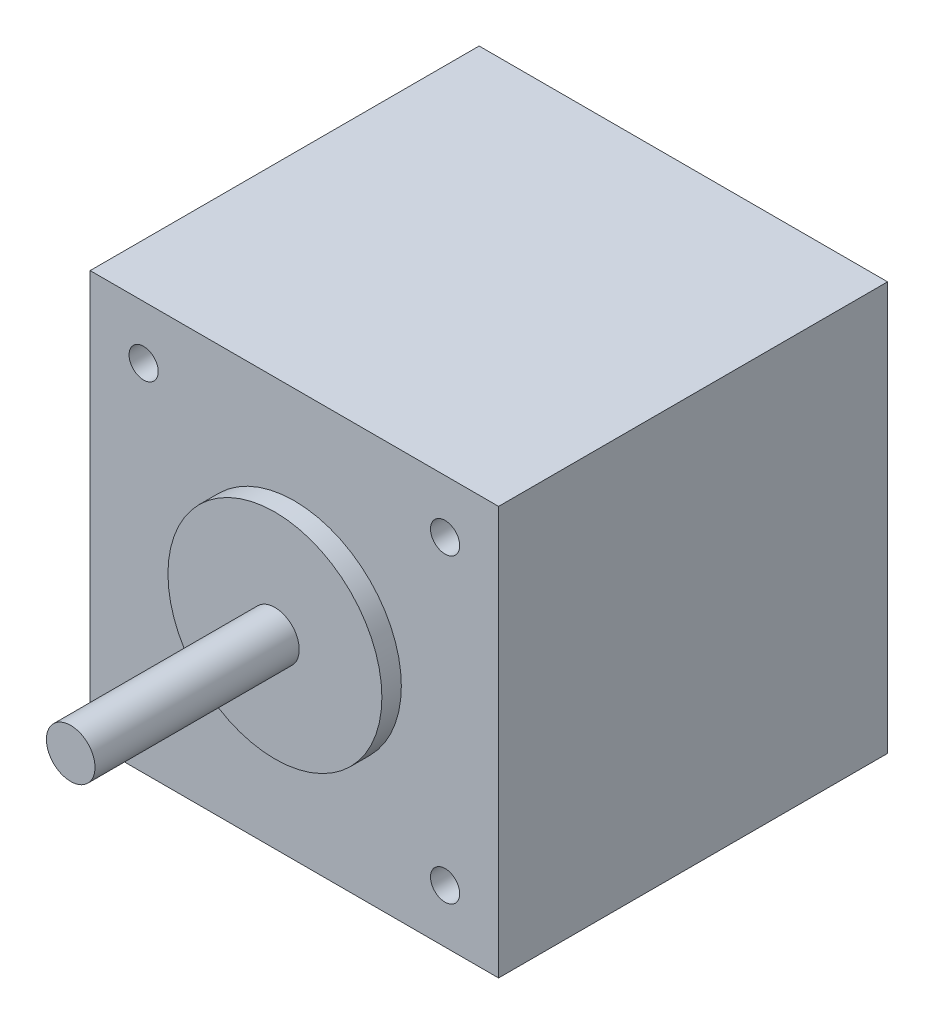
ISO-10303-21;
HEADER;
FILE_DESCRIPTION(('STEP AP214'),'2;1');
FILE_NAME('part.step','',(''),(''),'','','');
FILE_SCHEMA(('AUTOMOTIVE_DESIGN { 1 0 10303 214 1 1 1 1 }'));
ENDSEC;
DATA;
#1=APPLICATION_CONTEXT('core data for automotive mechanical design processes');
#2=APPLICATION_PROTOCOL_DEFINITION('international standard','automotive_design',2000,#1);
#3=PRODUCT_CONTEXT('',#1,'mechanical');
#4=PRODUCT('Part','Part','',(#3));
#5=PRODUCT_RELATED_PRODUCT_CATEGORY('part','',(#4));
#6=PRODUCT_DEFINITION_FORMATION('','',#4);
#7=PRODUCT_DEFINITION_CONTEXT('part definition',#1,'design');
#8=PRODUCT_DEFINITION('design','',#6,#7);
#9=PRODUCT_DEFINITION_SHAPE('','',#8);
#10=(LENGTH_UNIT() NAMED_UNIT(*) SI_UNIT(.MILLI.,.METRE.));
#11=(NAMED_UNIT(*) PLANE_ANGLE_UNIT() SI_UNIT($,.RADIAN.));
#12=(NAMED_UNIT(*) SI_UNIT($,.STERADIAN.) SOLID_ANGLE_UNIT());
#13=UNCERTAINTY_MEASURE_WITH_UNIT(LENGTH_MEASURE(1.E-05),#10,'distance_accuracy_value','');
#14=(GEOMETRIC_REPRESENTATION_CONTEXT(3) GLOBAL_UNCERTAINTY_ASSIGNED_CONTEXT((#13)) GLOBAL_UNIT_ASSIGNED_CONTEXT((#10,
#11,#12)) REPRESENTATION_CONTEXT('',''));
#15=CARTESIAN_POINT('',(0.,0.,0.));
#16=DIRECTION('',(0.,0.,1.));
#17=DIRECTION('',(1.,0.,0.));
#18=AXIS2_PLACEMENT_3D('',#15,#16,#17);
#19=CARTESIAN_POINT('',(21.,-21.,40.));
#20=DIRECTION('',(-1.,0.,0.));
#21=DIRECTION('',(0.,0.,1.));
#22=AXIS2_PLACEMENT_3D('',#19,#20,#21);
#23=PLANE('',#22);
#24=DIRECTION('',(0.,1.,0.));
#25=VECTOR('',#24,1.);
#26=CARTESIAN_POINT('',(21.,-21.,0.));
#27=LINE('',#26,#25);
#28=CARTESIAN_POINT('',(21.,-21.,0.));
#29=VERTEX_POINT('',#28);
#30=CARTESIAN_POINT('',(21.,21.,0.));
#31=VERTEX_POINT('',#30);
#32=EDGE_CURVE('E109',#29,#31,#27,.T.);
#33=ORIENTED_EDGE('',*,*,#32,.T.);
#34=DIRECTION('',(0.,0.,-1.));
#35=VECTOR('',#34,1.);
#36=CARTESIAN_POINT('',(21.,21.,40.));
#37=LINE('',#36,#35);
#38=CARTESIAN_POINT('',(21.,21.,40.));
#39=VERTEX_POINT('',#38);
#40=EDGE_CURVE('E50',#39,#31,#37,.T.);
#41=ORIENTED_EDGE('',*,*,#40,.F.);
#42=DIRECTION('',(0.,1.,0.));
#43=VECTOR('',#42,1.);
#44=CARTESIAN_POINT('',(21.,-21.,40.));
#45=LINE('',#44,#43);
#46=CARTESIAN_POINT('',(21.,-21.,40.));
#47=VERTEX_POINT('',#46);
#48=EDGE_CURVE('E95',#47,#39,#45,.T.);
#49=ORIENTED_EDGE('',*,*,#48,.F.);
#50=DIRECTION('',(0.,0.,-1.));
#51=VECTOR('',#50,1.);
#52=CARTESIAN_POINT('',(21.,-21.,40.));
#53=LINE('',#52,#51);
#54=EDGE_CURVE('E105',#47,#29,#53,.T.);
#55=ORIENTED_EDGE('',*,*,#54,.T.);
#56=EDGE_LOOP('',(#33,#41,#49,#55));
#57=FACE_BOUND('',#56,.T.);
#58=ADVANCED_FACE('F41',(#57),#23,.F.);
#59=CARTESIAN_POINT('',(-21.,21.,40.));
#60=DIRECTION('',(0.,-1.,0.));
#61=DIRECTION('',(0.,0.,-1.));
#62=AXIS2_PLACEMENT_3D('',#59,#60,#61);
#63=PLANE('',#62);
#64=DIRECTION('',(-1.,0.,0.));
#65=VECTOR('',#64,1.);
#66=CARTESIAN_POINT('',(-21.,21.,0.));
#67=LINE('',#66,#65);
#68=CARTESIAN_POINT('',(-21.,21.,0.));
#69=VERTEX_POINT('',#68);
#70=EDGE_CURVE('E100',#31,#69,#67,.T.);
#71=ORIENTED_EDGE('',*,*,#70,.T.);
#72=DIRECTION('',(0.,0.,-1.));
#73=VECTOR('',#72,1.);
#74=CARTESIAN_POINT('',(-21.,21.,40.));
#75=LINE('',#74,#73);
#76=CARTESIAN_POINT('',(-21.,21.,40.));
#77=VERTEX_POINT('',#76);
#78=EDGE_CURVE('E98',#77,#69,#75,.T.);
#79=ORIENTED_EDGE('',*,*,#78,.F.);
#80=DIRECTION('',(-1.,0.,0.));
#81=VECTOR('',#80,1.);
#82=CARTESIAN_POINT('',(-21.,21.,40.));
#83=LINE('',#82,#81);
#84=EDGE_CURVE('E90',#39,#77,#83,.T.);
#85=ORIENTED_EDGE('',*,*,#84,.F.);
#86=ORIENTED_EDGE('',*,*,#40,.T.);
#87=EDGE_LOOP('',(#71,#79,#85,#86));
#88=FACE_BOUND('',#87,.T.);
#89=ADVANCED_FACE('F99',(#88),#63,.F.);
#90=CARTESIAN_POINT('',(-21.,-21.,40.));
#91=DIRECTION('',(1.,0.,0.));
#92=DIRECTION('',(0.,0.,-1.));
#93=AXIS2_PLACEMENT_3D('',#90,#91,#92);
#94=PLANE('',#93);
#95=DIRECTION('',(0.,-1.,0.));
#96=VECTOR('',#95,1.);
#97=CARTESIAN_POINT('',(-21.,-21.,0.));
#98=LINE('',#97,#96);
#99=CARTESIAN_POINT('',(-21.,-21.,0.));
#100=VERTEX_POINT('',#99);
#101=EDGE_CURVE('E76',#69,#100,#98,.T.);
#102=ORIENTED_EDGE('',*,*,#101,.T.);
#103=DIRECTION('',(0.,0.,-1.));
#104=VECTOR('',#103,1.);
#105=CARTESIAN_POINT('',(-21.,-21.,40.));
#106=LINE('',#105,#104);
#107=CARTESIAN_POINT('',(-21.,-21.,40.));
#108=VERTEX_POINT('',#107);
#109=EDGE_CURVE('E101',#108,#100,#106,.T.);
#110=ORIENTED_EDGE('',*,*,#109,.F.);
#111=DIRECTION('',(0.,-1.,0.));
#112=VECTOR('',#111,1.);
#113=CARTESIAN_POINT('',(-21.,-21.,40.));
#114=LINE('',#113,#112);
#115=EDGE_CURVE('E93',#77,#108,#114,.T.);
#116=ORIENTED_EDGE('',*,*,#115,.F.);
#117=ORIENTED_EDGE('',*,*,#78,.T.);
#118=EDGE_LOOP('',(#102,#110,#116,#117));
#119=FACE_BOUND('',#118,.T.);
#120=ADVANCED_FACE('F103',(#119),#94,.F.);
#121=CARTESIAN_POINT('',(-21.,-21.,40.));
#122=DIRECTION('',(0.,1.,0.));
#123=DIRECTION('',(0.,0.,1.));
#124=AXIS2_PLACEMENT_3D('',#121,#122,#123);
#125=PLANE('',#124);
#126=DIRECTION('',(1.,0.,0.));
#127=VECTOR('',#126,1.);
#128=CARTESIAN_POINT('',(-21.,-21.,0.));
#129=LINE('',#128,#127);
#130=EDGE_CURVE('E82',#100,#29,#129,.T.);
#131=ORIENTED_EDGE('',*,*,#130,.T.);
#132=ORIENTED_EDGE('',*,*,#54,.F.);
#133=DIRECTION('',(1.,0.,0.));
#134=VECTOR('',#133,1.);
#135=CARTESIAN_POINT('',(-21.,-21.,40.));
#136=LINE('',#135,#134);
#137=EDGE_CURVE('E59',#108,#47,#136,.T.);
#138=ORIENTED_EDGE('',*,*,#137,.F.);
#139=ORIENTED_EDGE('',*,*,#109,.T.);
#140=EDGE_LOOP('',(#131,#132,#138,#139));
#141=FACE_BOUND('',#140,.T.);
#142=ADVANCED_FACE('F132',(#141),#125,.F.);
#143=CARTESIAN_POINT('',(0.,0.,40.));
#144=DIRECTION('',(0.,0.,-1.));
#145=DIRECTION('',(-1.,0.,0.));
#146=AXIS2_PLACEMENT_3D('',#143,#144,#145);
#147=PLANE('',#146);
#148=CARTESIAN_POINT('',(-15.5,15.5,40.));
#149=DIRECTION('',(0.,0.,1.));
#150=DIRECTION('',(1.,0.,0.));
#151=AXIS2_PLACEMENT_3D('',#148,#149,#150);
#152=CIRCLE('',#151,1.5);
#153=CARTESIAN_POINT('',(-14.,15.5,40.));
#154=VERTEX_POINT('',#153);
#155=EDGE_CURVE('E281',#154,#154,#152,.T.);
#156=ORIENTED_EDGE('',*,*,#155,.F.);
#157=EDGE_LOOP('',(#156));
#158=FACE_BOUND('',#157,.T.);
#159=CARTESIAN_POINT('',(15.5,-15.5,40.));
#160=DIRECTION('',(0.,0.,1.));
#161=DIRECTION('',(1.,0.,0.));
#162=AXIS2_PLACEMENT_3D('',#159,#160,#161);
#163=CIRCLE('',#162,1.5);
#164=CARTESIAN_POINT('',(17.,-15.5,40.));
#165=VERTEX_POINT('',#164);
#166=EDGE_CURVE('E287',#165,#165,#163,.T.);
#167=ORIENTED_EDGE('',*,*,#166,.F.);
#168=EDGE_LOOP('',(#167));
#169=FACE_BOUND('',#168,.T.);
#170=CARTESIAN_POINT('',(15.5,15.5,40.));
#171=DIRECTION('',(0.,0.,1.));
#172=DIRECTION('',(1.,0.,0.));
#173=AXIS2_PLACEMENT_3D('',#170,#171,#172);
#174=CIRCLE('',#173,1.5);
#175=CARTESIAN_POINT('',(17.,15.5,40.));
#176=VERTEX_POINT('',#175);
#177=EDGE_CURVE('E288',#176,#176,#174,.T.);
#178=ORIENTED_EDGE('',*,*,#177,.F.);
#179=EDGE_LOOP('',(#178));
#180=FACE_BOUND('',#179,.T.);
#181=CARTESIAN_POINT('',(-15.5,-15.5,40.));
#182=DIRECTION('',(0.,0.,1.));
#183=DIRECTION('',(1.,0.,0.));
#184=AXIS2_PLACEMENT_3D('',#181,#182,#183);
#185=CIRCLE('',#184,1.5);
#186=CARTESIAN_POINT('',(-14.,-15.5,40.));
#187=VERTEX_POINT('',#186);
#188=EDGE_CURVE('E278',#187,#187,#185,.T.);
#189=ORIENTED_EDGE('',*,*,#188,.F.);
#190=EDGE_LOOP('',(#189));
#191=FACE_BOUND('',#190,.T.);
#192=CARTESIAN_POINT('',(0.,0.,40.));
#193=DIRECTION('',(0.,0.,-1.));
#194=DIRECTION('',(-1.,0.,0.));
#195=AXIS2_PLACEMENT_3D('',#192,#193,#194);
#196=CIRCLE('',#195,11.);
#197=CARTESIAN_POINT('',(-11.,0.,40.));
#198=VERTEX_POINT('',#197);
#199=EDGE_CURVE('E11',#198,#198,#196,.F.);
#200=ORIENTED_EDGE('',*,*,#199,.F.);
#201=EDGE_LOOP('',(#200));
#202=FACE_BOUND('',#201,.T.);
#203=ORIENTED_EDGE('',*,*,#48,.T.);
#204=ORIENTED_EDGE('',*,*,#84,.T.);
#205=ORIENTED_EDGE('',*,*,#115,.T.);
#206=ORIENTED_EDGE('',*,*,#137,.T.);
#207=EDGE_LOOP('',(#203,#204,#205,#206));
#208=FACE_BOUND('',#207,.T.);
#209=ADVANCED_FACE('F91',(#158,#169,#180,#191,#202,#208),#147,.F.);
#210=CARTESIAN_POINT('',(0.,0.,0.));
#211=DIRECTION('',(0.,0.,-1.));
#212=DIRECTION('',(-1.,0.,0.));
#213=AXIS2_PLACEMENT_3D('',#210,#211,#212);
#214=PLANE('',#213);
#215=ORIENTED_EDGE('',*,*,#32,.F.);
#216=ORIENTED_EDGE('',*,*,#130,.F.);
#217=ORIENTED_EDGE('',*,*,#101,.F.);
#218=ORIENTED_EDGE('',*,*,#70,.F.);
#219=EDGE_LOOP('',(#215,#216,#217,#218));
#220=FACE_BOUND('',#219,.T.);
#221=ADVANCED_FACE('F120',(#220),#214,.T.);
#222=CARTESIAN_POINT('',(0.,0.,42.));
#223=DIRECTION('',(0.,0.,-1.));
#224=DIRECTION('',(-1.,0.,0.));
#225=AXIS2_PLACEMENT_3D('',#222,#223,#224);
#226=CYLINDRICAL_SURFACE('',#225,11.);
#227=CARTESIAN_POINT('',(0.,0.,42.));
#228=DIRECTION('',(0.,0.,1.));
#229=DIRECTION('',(1.,0.,0.));
#230=AXIS2_PLACEMENT_3D('',#227,#228,#229);
#231=CIRCLE('',#230,11.);
#232=CARTESIAN_POINT('',(-11.,0.,42.));
#233=VERTEX_POINT('',#232);
#234=EDGE_CURVE('E273',#233,#233,#231,.T.);
#235=CARTESIAN_POINT('',(-11.,0.,42.));
#236=CARTESIAN_POINT('',(-11.,0.,41.9791666666667));
#237=CARTESIAN_POINT('',(-11.,0.,41.9583333333333));
#238=CARTESIAN_POINT('',(-11.,0.,41.9166666666667));
#239=CARTESIAN_POINT('',(-11.,0.,41.8958333333333));
#240=CARTESIAN_POINT('',(-11.,0.,41.8541666666667));
#241=CARTESIAN_POINT('',(-11.,0.,41.8333333333333));
#242=CARTESIAN_POINT('',(-11.,0.,41.7916666666667));
#243=CARTESIAN_POINT('',(-11.,0.,41.7708333333333));
#244=CARTESIAN_POINT('',(-11.,0.,41.7291666666667));
#245=CARTESIAN_POINT('',(-11.,0.,41.7083333333333));
#246=CARTESIAN_POINT('',(-11.,0.,41.6666666666667));
#247=CARTESIAN_POINT('',(-11.,0.,41.6458333333333));
#248=CARTESIAN_POINT('',(-11.,0.,41.6041666666667));
#249=CARTESIAN_POINT('',(-11.,0.,41.5833333333333));
#250=CARTESIAN_POINT('',(-11.,0.,41.5416666666667));
#251=CARTESIAN_POINT('',(-11.,0.,41.5208333333333));
#252=CARTESIAN_POINT('',(-11.,0.,41.4791666666667));
#253=CARTESIAN_POINT('',(-11.,0.,41.4583333333333));
#254=CARTESIAN_POINT('',(-11.,0.,41.4166666666667));
#255=CARTESIAN_POINT('',(-11.,0.,41.3958333333333));
#256=CARTESIAN_POINT('',(-11.,0.,41.3541666666667));
#257=CARTESIAN_POINT('',(-11.,0.,41.3333333333333));
#258=CARTESIAN_POINT('',(-11.,0.,41.2916666666667));
#259=CARTESIAN_POINT('',(-11.,0.,41.2708333333333));
#260=CARTESIAN_POINT('',(-11.,0.,41.2291666666667));
#261=CARTESIAN_POINT('',(-11.,0.,41.2083333333333));
#262=CARTESIAN_POINT('',(-11.,0.,41.1666666666667));
#263=CARTESIAN_POINT('',(-11.,0.,41.1458333333333));
#264=CARTESIAN_POINT('',(-11.,0.,41.1041666666667));
#265=CARTESIAN_POINT('',(-11.,0.,41.0833333333333));
#266=CARTESIAN_POINT('',(-11.,0.,41.0416666666667));
#267=CARTESIAN_POINT('',(-11.,0.,41.0208333333333));
#268=CARTESIAN_POINT('',(-11.,0.,40.9791666666667));
#269=CARTESIAN_POINT('',(-11.,0.,40.9583333333333));
#270=CARTESIAN_POINT('',(-11.,0.,40.9166666666667));
#271=CARTESIAN_POINT('',(-11.,0.,40.8958333333333));
#272=CARTESIAN_POINT('',(-11.,0.,40.8541666666667));
#273=CARTESIAN_POINT('',(-11.,0.,40.8333333333333));
#274=CARTESIAN_POINT('',(-11.,0.,40.7916666666667));
#275=CARTESIAN_POINT('',(-11.,0.,40.7708333333333));
#276=CARTESIAN_POINT('',(-11.,0.,40.7291666666667));
#277=CARTESIAN_POINT('',(-11.,0.,40.7083333333333));
#278=CARTESIAN_POINT('',(-11.,0.,40.6666666666667));
#279=CARTESIAN_POINT('',(-11.,0.,40.6458333333333));
#280=CARTESIAN_POINT('',(-11.,0.,40.6041666666667));
#281=CARTESIAN_POINT('',(-11.,0.,40.5833333333333));
#282=CARTESIAN_POINT('',(-11.,0.,40.5416666666667));
#283=CARTESIAN_POINT('',(-11.,0.,40.5208333333333));
#284=CARTESIAN_POINT('',(-11.,0.,40.4791666666667));
#285=CARTESIAN_POINT('',(-11.,0.,40.4583333333333));
#286=CARTESIAN_POINT('',(-11.,0.,40.4166666666667));
#287=CARTESIAN_POINT('',(-11.,0.,40.3958333333333));
#288=CARTESIAN_POINT('',(-11.,0.,40.3541666666667));
#289=CARTESIAN_POINT('',(-11.,0.,40.3333333333333));
#290=CARTESIAN_POINT('',(-11.,0.,40.2916666666667));
#291=CARTESIAN_POINT('',(-11.,0.,40.2708333333333));
#292=CARTESIAN_POINT('',(-11.,0.,40.2291666666667));
#293=CARTESIAN_POINT('',(-11.,0.,40.2083333333333));
#294=CARTESIAN_POINT('',(-11.,0.,40.1666666666667));
#295=CARTESIAN_POINT('',(-11.,0.,40.1458333333333));
#296=CARTESIAN_POINT('',(-11.,0.,40.1041666666667));
#297=CARTESIAN_POINT('',(-11.,0.,40.0833333333333));
#298=CARTESIAN_POINT('',(-11.,0.,40.0416666666667));
#299=CARTESIAN_POINT('',(-11.,0.,40.0208333333333));
#300=CARTESIAN_POINT('',(-11.,0.,40.));
#301=B_SPLINE_CURVE_WITH_KNOTS('',3,(#235,#236,#237,#238,#239,#240,#241,#242,#243,#244,#245,
#246,#247,#248,#249,#250,#251,#252,#253,#254,#255,#256,#257,#258,#259,#260,#261,#262,#263,#264,
#265,#266,#267,#268,#269,#270,#271,#272,#273,#274,#275,#276,#277,#278,#279,#280,#281,#282,#283,
#284,#285,#286,#287,#288,#289,#290,#291,#292,#293,#294,#295,#296,#297,#298,#299,#300),
.UNSPECIFIED.,.F.,.F.,(4,2,2,2,2,2,2,2,2,2,2,2,2,2,2,2,2,2,2,2,2,2,2,2,2,2,2,2,2,2,2,2,4),(0.,
0.0624999999999931,0.124999999999993,0.187499999999993,0.249999999999993,0.312499999999993,
0.374999999999993,0.437499999999993,0.499999999999994,0.562499999999994,0.624999999999994,
0.687499999999994,0.749999999999994,0.812499999999994,0.874999999999994,0.937499999999994,
0.999999999999994,1.06249999999999,1.12499999999999,1.18749999999999,1.24999999999999,
1.31249999999999,1.37499999999999,1.43749999999999,1.49999999999999,1.56249999999999,
1.62499999999999,1.68749999999999,1.74999999999999,1.81249999999999,1.87499999999999,
1.93749999999999,1.99999999999999),.UNSPECIFIED.);
#302=EDGE_CURVE('BSEAM122',#233,#198,#301,.T.);
#303=ORIENTED_EDGE('',*,*,#234,.F.);
#304=ORIENTED_EDGE('',*,*,#199,.T.);
#305=ORIENTED_EDGE('',*,*,#302,.T.);
#306=ORIENTED_EDGE('',*,*,#302,.F.);
#307=EDGE_LOOP('',(#303,#305,#304,#306));
#308=FACE_BOUND('',#307,.T.);
#309=ADVANCED_FACE('F122',(#308),#226,.T.);
#310=CARTESIAN_POINT('',(0.,0.,42.));
#311=DIRECTION('',(0.,0.,1.));
#312=DIRECTION('',(1.,0.,0.));
#313=AXIS2_PLACEMENT_3D('',#310,#311,#312);
#314=PLANE('',#313);
#315=CARTESIAN_POINT('',(0.,0.,42.));
#316=DIRECTION('',(0.,0.,1.));
#317=DIRECTION('',(1.,0.,0.));
#318=AXIS2_PLACEMENT_3D('',#315,#316,#317);
#319=CIRCLE('',#318,2.5);
#320=CARTESIAN_POINT('',(2.5,0.,42.));
#321=VERTEX_POINT('',#320);
#322=EDGE_CURVE('E44',#321,#321,#319,.T.);
#323=ORIENTED_EDGE('',*,*,#322,.F.);
#324=EDGE_LOOP('',(#323));
#325=FACE_BOUND('',#324,.T.);
#326=ORIENTED_EDGE('',*,*,#234,.T.);
#327=EDGE_LOOP('',(#326));
#328=FACE_BOUND('',#327,.T.);
#329=ADVANCED_FACE('F128',(#325,#328),#314,.T.);
#330=CARTESIAN_POINT('',(0.,0.,63.));
#331=DIRECTION('',(0.,0.,1.));
#332=DIRECTION('',(1.,0.,0.));
#333=AXIS2_PLACEMENT_3D('',#330,#331,#332);
#334=PLANE('',#333);
#335=CARTESIAN_POINT('',(0.,0.,63.));
#336=DIRECTION('',(0.,0.,1.));
#337=DIRECTION('',(1.,0.,0.));
#338=AXIS2_PLACEMENT_3D('',#335,#336,#337);
#339=CIRCLE('',#338,2.5);
#340=CARTESIAN_POINT('',(2.5,0.,63.));
#341=VERTEX_POINT('',#340);
#342=EDGE_CURVE('E112',#341,#341,#339,.T.);
#343=ORIENTED_EDGE('',*,*,#342,.T.);
#344=EDGE_LOOP('',(#343));
#345=FACE_BOUND('',#344,.T.);
#346=ADVANCED_FACE('F153',(#345),#334,.T.);
#347=CARTESIAN_POINT('',(0.,0.,63.));
#348=DIRECTION('',(0.,0.,-1.));
#349=DIRECTION('',(-1.,0.,0.));
#350=AXIS2_PLACEMENT_3D('',#347,#348,#349);
#351=CYLINDRICAL_SURFACE('',#350,2.5);
#352=ORIENTED_EDGE('',*,*,#322,.T.);
#353=EDGE_LOOP('',(#352));
#354=FACE_BOUND('',#353,.T.);
#355=ORIENTED_EDGE('',*,*,#342,.F.);
#356=EDGE_LOOP('',(#355));
#357=FACE_BOUND('',#356,.T.);
#358=ADVANCED_FACE('F156',(#354,#357),#351,.T.);
#359=CARTESIAN_POINT('',(-15.5,-15.5,35.5));
#360=DIRECTION('',(0.,0.,1.));
#361=DIRECTION('',(1.,0.,0.));
#362=AXIS2_PLACEMENT_3D('',#359,#360,#361);
#363=CYLINDRICAL_SURFACE('',#362,1.5);
#364=CARTESIAN_POINT('',(-15.5,-15.5,35.5));
#365=DIRECTION('',(0.,0.,1.));
#366=DIRECTION('',(1.,0.,0.));
#367=AXIS2_PLACEMENT_3D('',#364,#365,#366);
#368=CIRCLE('',#367,1.5);
#369=CARTESIAN_POINT('',(-14.,-15.5,35.5));
#370=VERTEX_POINT('',#369);
#371=EDGE_CURVE('E277',#370,#370,#368,.T.);
#372=ORIENTED_EDGE('',*,*,#371,.F.);
#373=EDGE_LOOP('',(#372));
#374=FACE_BOUND('',#373,.T.);
#375=ORIENTED_EDGE('',*,*,#188,.T.);
#376=EDGE_LOOP('',(#375));
#377=FACE_BOUND('',#376,.T.);
#378=ADVANCED_FACE('F185',(#374,#377),#363,.F.);
#379=CARTESIAN_POINT('',(-15.5,-15.5,35.5));
#380=DIRECTION('',(0.,0.,1.));
#381=DIRECTION('',(1.,0.,0.));
#382=AXIS2_PLACEMENT_3D('',#379,#380,#381);
#383=PLANE('',#382);
#384=ORIENTED_EDGE('',*,*,#371,.T.);
#385=EDGE_LOOP('',(#384));
#386=FACE_BOUND('',#385,.T.);
#387=ADVANCED_FACE('F190',(#386),#383,.T.);
#388=CARTESIAN_POINT('',(15.5,15.5,35.5));
#389=DIRECTION('',(0.,0.,1.));
#390=DIRECTION('',(1.,0.,0.));
#391=AXIS2_PLACEMENT_3D('',#388,#389,#390);
#392=CYLINDRICAL_SURFACE('',#391,1.5);
#393=CARTESIAN_POINT('',(15.5,15.5,35.5));
#394=DIRECTION('',(0.,0.,1.));
#395=DIRECTION('',(1.,0.,0.));
#396=AXIS2_PLACEMENT_3D('',#393,#394,#395);
#397=CIRCLE('',#396,1.5);
#398=CARTESIAN_POINT('',(17.,15.5,35.5));
#399=VERTEX_POINT('',#398);
#400=EDGE_CURVE('E295',#399,#399,#397,.T.);
#401=ORIENTED_EDGE('',*,*,#400,.F.);
#402=EDGE_LOOP('',(#401));
#403=FACE_BOUND('',#402,.T.);
#404=ORIENTED_EDGE('',*,*,#177,.T.);
#405=EDGE_LOOP('',(#404));
#406=FACE_BOUND('',#405,.T.);
#407=ADVANCED_FACE('F200',(#403,#406),#392,.F.);
#408=CARTESIAN_POINT('',(15.5,15.5,35.5));
#409=DIRECTION('',(0.,0.,1.));
#410=DIRECTION('',(1.,0.,0.));
#411=AXIS2_PLACEMENT_3D('',#408,#409,#410);
#412=PLANE('',#411);
#413=ORIENTED_EDGE('',*,*,#400,.T.);
#414=EDGE_LOOP('',(#413));
#415=FACE_BOUND('',#414,.T.);
#416=ADVANCED_FACE('F210',(#415),#412,.T.);
#417=CARTESIAN_POINT('',(15.5,-15.5,35.5));
#418=DIRECTION('',(0.,0.,1.));
#419=DIRECTION('',(1.,0.,0.));
#420=AXIS2_PLACEMENT_3D('',#417,#418,#419);
#421=CYLINDRICAL_SURFACE('',#420,1.5);
#422=CARTESIAN_POINT('',(15.5,-15.5,35.5));
#423=DIRECTION('',(0.,0.,1.));
#424=DIRECTION('',(1.,0.,0.));
#425=AXIS2_PLACEMENT_3D('',#422,#423,#424);
#426=CIRCLE('',#425,1.5);
#427=CARTESIAN_POINT('',(17.,-15.5,35.5));
#428=VERTEX_POINT('',#427);
#429=EDGE_CURVE('E284',#428,#428,#426,.T.);
#430=ORIENTED_EDGE('',*,*,#429,.F.);
#431=EDGE_LOOP('',(#430));
#432=FACE_BOUND('',#431,.T.);
#433=ORIENTED_EDGE('',*,*,#166,.T.);
#434=EDGE_LOOP('',(#433));
#435=FACE_BOUND('',#434,.T.);
#436=ADVANCED_FACE('F220',(#432,#435),#421,.F.);
#437=CARTESIAN_POINT('',(15.5,-15.5,35.5));
#438=DIRECTION('',(0.,0.,1.));
#439=DIRECTION('',(1.,0.,0.));
#440=AXIS2_PLACEMENT_3D('',#437,#438,#439);
#441=PLANE('',#440);
#442=ORIENTED_EDGE('',*,*,#429,.T.);
#443=EDGE_LOOP('',(#442));
#444=FACE_BOUND('',#443,.T.);
#445=ADVANCED_FACE('F230',(#444),#441,.T.);
#446=CARTESIAN_POINT('',(-15.5,15.5,35.5));
#447=DIRECTION('',(0.,0.,1.));
#448=DIRECTION('',(1.,0.,0.));
#449=AXIS2_PLACEMENT_3D('',#446,#447,#448);
#450=CYLINDRICAL_SURFACE('',#449,1.5);
#451=CARTESIAN_POINT('',(-15.5,15.5,35.5));
#452=DIRECTION('',(0.,0.,1.));
#453=DIRECTION('',(1.,0.,0.));
#454=AXIS2_PLACEMENT_3D('',#451,#452,#453);
#455=CIRCLE('',#454,1.5);
#456=CARTESIAN_POINT('',(-14.,15.5,35.5));
#457=VERTEX_POINT('',#456);
#458=EDGE_CURVE('E291',#457,#457,#455,.T.);
#459=ORIENTED_EDGE('',*,*,#458,.F.);
#460=EDGE_LOOP('',(#459));
#461=FACE_BOUND('',#460,.T.);
#462=ORIENTED_EDGE('',*,*,#155,.T.);
#463=EDGE_LOOP('',(#462));
#464=FACE_BOUND('',#463,.T.);
#465=ADVANCED_FACE('F240',(#461,#464),#450,.F.);
#466=CARTESIAN_POINT('',(-15.5,15.5,35.5));
#467=DIRECTION('',(0.,0.,1.));
#468=DIRECTION('',(1.,0.,0.));
#469=AXIS2_PLACEMENT_3D('',#466,#467,#468);
#470=PLANE('',#469);
#471=ORIENTED_EDGE('',*,*,#458,.T.);
#472=EDGE_LOOP('',(#471));
#473=FACE_BOUND('',#472,.T.);
#474=ADVANCED_FACE('F250',(#473),#470,.T.);
#475=CLOSED_SHELL('',(#58,#89,#120,#142,#209,#221,#309,#329,#346,#358,#378,#387,#407,#416,#436,
#445,#465,#474));
#476=MANIFOLD_SOLID_BREP('B2',#475);
#477=ADVANCED_BREP_SHAPE_REPRESENTATION('',(#18,#476),#14);
#478=SHAPE_DEFINITION_REPRESENTATION(#9,#477);
ENDSEC;
END-ISO-10303-21;
